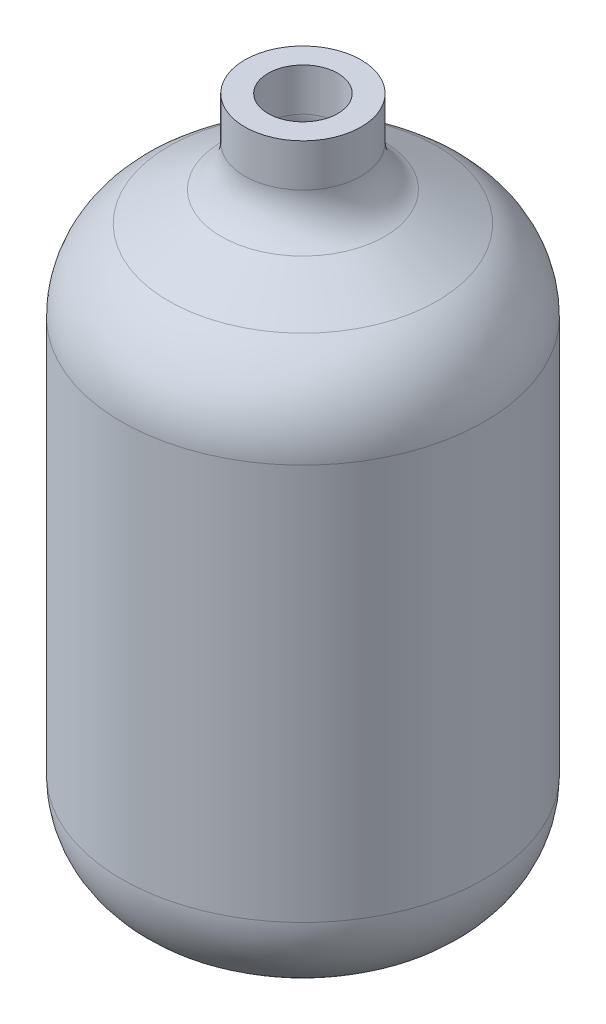
ISO-10303-21;
HEADER;
FILE_DESCRIPTION(('STEP AP214'),'2;1');
FILE_NAME('part.step','',(''),(''),'','','');
FILE_SCHEMA(('AUTOMOTIVE_DESIGN { 1 0 10303 214 1 1 1 1 }'));
ENDSEC;
DATA;
#1=APPLICATION_CONTEXT('core data for automotive mechanical design processes');
#2=APPLICATION_PROTOCOL_DEFINITION('international standard','automotive_design',2000,#1);
#3=PRODUCT_CONTEXT('',#1,'mechanical');
#4=PRODUCT('Part','Part','',(#3));
#5=PRODUCT_RELATED_PRODUCT_CATEGORY('part','',(#4));
#6=PRODUCT_DEFINITION_FORMATION('','',#4);
#7=PRODUCT_DEFINITION_CONTEXT('part definition',#1,'design');
#8=PRODUCT_DEFINITION('design','',#6,#7);
#9=PRODUCT_DEFINITION_SHAPE('','',#8);
#10=(LENGTH_UNIT() NAMED_UNIT(*) SI_UNIT(.MILLI.,.METRE.));
#11=(NAMED_UNIT(*) PLANE_ANGLE_UNIT() SI_UNIT($,.RADIAN.));
#12=(NAMED_UNIT(*) SI_UNIT($,.STERADIAN.) SOLID_ANGLE_UNIT());
#13=UNCERTAINTY_MEASURE_WITH_UNIT(LENGTH_MEASURE(1.E-05),#10,'distance_accuracy_value','');
#14=(GEOMETRIC_REPRESENTATION_CONTEXT(3) GLOBAL_UNCERTAINTY_ASSIGNED_CONTEXT((#13)) GLOBAL_UNIT_ASSIGNED_CONTEXT((#10,
#11,#12)) REPRESENTATION_CONTEXT('',''));
#15=CARTESIAN_POINT('',(0.,0.,0.));
#16=DIRECTION('',(0.,0.,1.));
#17=DIRECTION('',(1.,0.,0.));
#18=AXIS2_PLACEMENT_3D('',#15,#16,#17);
#19=CARTESIAN_POINT('',(0.,0.,0.));
#20=DIRECTION('',(0.,-1.,0.));
#21=DIRECTION('',(-1.,0.,0.));
#22=AXIS2_PLACEMENT_3D('',#19,#20,#21);
#23=SPHERICAL_SURFACE('',#22,25.4);
#24=CARTESIAN_POINT('',(0.,-23.3340278881508,0.));
#25=DIRECTION('',(0.,-1.,0.));
#26=DIRECTION('',(0.,0.,-1.));
#27=AXIS2_PLACEMENT_3D('',#24,#25,#26);
#28=CIRCLE('',#27,10.0340989886986);
#29=CARTESIAN_POINT('',(0.,-23.3340278881508,10.0340989886986));
#30=VERTEX_POINT('',#29);
#31=EDGE_CURVE('E10',#30,#30,#28,.T.);
#32=ORIENTED_EDGE('',*,*,#31,.T.);
#33=EDGE_LOOP('',(#32));
#34=FACE_BOUND('',#33,.T.);
#35=ADVANCED_FACE('F32',(#34),#23,.T.);
#36=CARTESIAN_POINT('',(0.,-12.9576449611273,0.));
#37=DIRECTION('',(0.,1.,0.));
#38=DIRECTION('',(0.,0.,1.));
#39=AXIS2_PLACEMENT_3D('',#36,#37,#38);
#40=CONICAL_SURFACE('',#39,34.1640989886986,1.1646813781007);
#41=CARTESIAN_POINT('',(0.,-12.9576449611273,0.));
#42=DIRECTION('',(0.,-1.,0.));
#43=DIRECTION('',(0.,0.,-1.));
#44=AXIS2_PLACEMENT_3D('',#41,#42,#43);
#45=CIRCLE('',#44,34.1640989886986);
#46=CARTESIAN_POINT('',(0.,-12.9576449611273,34.1640989886986));
#47=VERTEX_POINT('',#46);
#48=EDGE_CURVE('E38',#47,#47,#45,.T.);
#49=CARTESIAN_POINT('',(0.,-23.3340278881508,10.0340989886986));
#50=CARTESIAN_POINT('',(0.,-23.2259405659943,10.2854531553653));
#51=CARTESIAN_POINT('',(0.,-23.1178532438378,10.536807322032));
#52=CARTESIAN_POINT('',(0.,-22.9016785995248,11.0395156553653));
#53=CARTESIAN_POINT('',(0.,-22.7935912773683,11.290869822032));
#54=CARTESIAN_POINT('',(0.,-22.5774166330553,11.7935781553653));
#55=CARTESIAN_POINT('',(0.,-22.4693293108988,12.044932322032));
#56=CARTESIAN_POINT('',(0.,-22.2531546665858,12.5476406553653));
#57=CARTESIAN_POINT('',(0.,-22.1450673444293,12.798994822032));
#58=CARTESIAN_POINT('',(0.,-21.9288927001163,13.3017031553653));
#59=CARTESIAN_POINT('',(0.,-21.8208053779598,13.553057322032));
#60=CARTESIAN_POINT('',(0.,-21.6046307336468,14.0557656553653));
#61=CARTESIAN_POINT('',(0.,-21.4965434114904,14.307119822032));
#62=CARTESIAN_POINT('',(0.,-21.2803687671774,14.8098281553653));
#63=CARTESIAN_POINT('',(0.,-21.1722814450209,15.061182322032));
#64=CARTESIAN_POINT('',(0.,-20.9561068007079,15.5638906553653));
#65=CARTESIAN_POINT('',(0.,-20.8480194785514,15.815244822032));
#66=CARTESIAN_POINT('',(0.,-20.6318448342384,16.3179531553653));
#67=CARTESIAN_POINT('',(0.,-20.5237575120819,16.569307322032));
#68=CARTESIAN_POINT('',(0.,-20.3075828677689,17.0720156553653));
#69=CARTESIAN_POINT('',(0.,-20.1994955456124,17.323369822032));
#70=CARTESIAN_POINT('',(0.,-19.9833209012994,17.8260781553653));
#71=CARTESIAN_POINT('',(0.,-19.8752335791429,18.077432322032));
#72=CARTESIAN_POINT('',(0.,-19.6590589348299,18.5801406553653));
#73=CARTESIAN_POINT('',(0.,-19.5509716126734,18.831494822032));
#74=CARTESIAN_POINT('',(0.,-19.3347969683605,19.3342031553653));
#75=CARTESIAN_POINT('',(0.,-19.226709646204,19.585557322032));
#76=CARTESIAN_POINT('',(0.,-19.010535001891,20.0882656553653));
#77=CARTESIAN_POINT('',(0.,-18.9024476797345,20.339619822032));
#78=CARTESIAN_POINT('',(0.,-18.6862730354215,20.8423281553653));
#79=CARTESIAN_POINT('',(0.,-18.578185713265,21.093682322032));
#80=CARTESIAN_POINT('',(0.,-18.362011068952,21.5963906553653));
#81=CARTESIAN_POINT('',(0.,-18.2539237467955,21.847744822032));
#82=CARTESIAN_POINT('',(0.,-18.0377491024825,22.3504531553653));
#83=CARTESIAN_POINT('',(0.,-17.929661780326,22.601807322032));
#84=CARTESIAN_POINT('',(0.,-17.713487136013,23.1045156553653));
#85=CARTESIAN_POINT('',(0.,-17.6053998138565,23.355869822032));
#86=CARTESIAN_POINT('',(0.,-17.3892251695435,23.8585781553653));
#87=CARTESIAN_POINT('',(0.,-17.2811378473871,24.109932322032));
#88=CARTESIAN_POINT('',(0.,-17.0649632030741,24.6126406553653));
#89=CARTESIAN_POINT('',(0.,-16.9568758809176,24.863994822032));
#90=CARTESIAN_POINT('',(0.,-16.7407012366046,25.3667031553653));
#91=CARTESIAN_POINT('',(0.,-16.6326139144481,25.618057322032));
#92=CARTESIAN_POINT('',(0.,-16.4164392701351,26.1207656553653));
#93=CARTESIAN_POINT('',(0.,-16.3083519479786,26.372119822032));
#94=CARTESIAN_POINT('',(0.,-16.0921773036656,26.8748281553653));
#95=CARTESIAN_POINT('',(0.,-15.9840899815091,27.126182322032));
#96=CARTESIAN_POINT('',(0.,-15.7679153371961,27.6288906553653));
#97=CARTESIAN_POINT('',(0.,-15.6598280150396,27.880244822032));
#98=CARTESIAN_POINT('',(0.,-15.4436533707266,28.3829531553653));
#99=CARTESIAN_POINT('',(0.,-15.3355660485701,28.634307322032));
#100=CARTESIAN_POINT('',(0.,-15.1193914042572,29.1370156553653));
#101=CARTESIAN_POINT('',(0.,-15.0113040821007,29.388369822032));
#102=CARTESIAN_POINT('',(0.,-14.7951294377877,29.8910781553653));
#103=CARTESIAN_POINT('',(0.,-14.6870421156312,30.142432322032));
#104=CARTESIAN_POINT('',(0.,-14.4708674713182,30.6451406553653));
#105=CARTESIAN_POINT('',(0.,-14.3627801491617,30.896494822032));
#106=CARTESIAN_POINT('',(0.,-14.1466055048487,31.3992031553653));
#107=CARTESIAN_POINT('',(0.,-14.0385181826922,31.650557322032));
#108=CARTESIAN_POINT('',(0.,-13.8223435383792,32.1532656553653));
#109=CARTESIAN_POINT('',(0.,-13.7142562162227,32.404619822032));
#110=CARTESIAN_POINT('',(0.,-13.4980815719097,32.9073281553653));
#111=CARTESIAN_POINT('',(0.,-13.3899942497532,33.158682322032));
#112=CARTESIAN_POINT('',(0.,-13.1738196054402,33.6613906553653));
#113=CARTESIAN_POINT('',(0.,-13.0657322832838,33.912744822032));
#114=CARTESIAN_POINT('',(0.,-12.9576449611273,34.1640989886986));
#115=B_SPLINE_CURVE_WITH_KNOTS('',3,(#49,#50,#51,#52,#53,#54,#55,#56,#57,#58,#59,#60,#61,#62,
#63,#64,#65,#66,#67,#68,#69,#70,#71,#72,#73,#74,#75,#76,#77,#78,#79,#80,#81,#82,#83,#84,#85,#86,
#87,#88,#89,#90,#91,#92,#93,#94,#95,#96,#97,#98,#99,#100,#101,#102,#103,#104,#105,#106,#107,
#108,#109,#110,#111,#112,#113,#114),.UNSPECIFIED.,.F.,.F.,(4,2,2,2,2,2,2,2,2,2,2,2,2,2,2,2,2,2,
2,2,2,2,2,2,2,2,2,2,2,2,2,2,4),(0.,0.820826459615494,1.64165291923099,2.46247937884648,
3.28330583846197,4.10413229807747,4.92495875769296,5.74578521730846,6.56661167692395,
7.38743813653944,8.20826459615494,9.02909105577043,9.84991751538592,10.6707439750014,
11.4915704346169,12.3123968942324,13.1332233538479,13.9540498134634,14.7748762730789,
15.5957027326944,16.4165291923099,17.2373556519254,18.0581821115409,18.8790085711564,
19.6998350307719,20.5206614903874,21.3414879500029,22.1623144096183,22.9831408692338,
23.8039673288493,24.6247937884648,25.4456202480803,26.2664467076958),.UNSPECIFIED.);
#116=EDGE_CURVE('BSEAM105',#30,#47,#115,.T.);
#117=ORIENTED_EDGE('',*,*,#31,.F.);
#118=ORIENTED_EDGE('',*,*,#48,.T.);
#119=ORIENTED_EDGE('',*,*,#116,.T.);
#120=ORIENTED_EDGE('',*,*,#116,.F.);
#121=EDGE_LOOP('',(#117,#119,#118,#120));
#122=FACE_BOUND('',#121,.T.);
#123=ADVANCED_FACE('F105',(#122),#40,.T.);
#124=CARTESIAN_POINT('',(0.,10.3763829270235,0.));
#125=DIRECTION('',(0.,-1.,0.));
#126=DIRECTION('',(0.,0.,-1.));
#127=AXIS2_PLACEMENT_3D('',#124,#125,#126);
#128=DEGENERATE_TOROIDAL_SURFACE('',#127,24.13,25.4,.T.);
#129=ORIENTED_EDGE('',*,*,#48,.F.);
#130=EDGE_LOOP('',(#129));
#131=FACE_BOUND('',#130,.T.);
#132=CARTESIAN_POINT('',(0.,10.3763829270235,0.));
#133=DIRECTION('',(0.,-1.,0.));
#134=DIRECTION('',(0.,0.,-1.));
#135=AXIS2_PLACEMENT_3D('',#132,#133,#134);
#136=CIRCLE('',#135,49.53);
#137=CARTESIAN_POINT('',(0.,10.3763829270235,-49.53));
#138=VERTEX_POINT('',#137);
#139=EDGE_CURVE('E42',#138,#138,#136,.T.);
#140=ORIENTED_EDGE('',*,*,#139,.T.);
#141=EDGE_LOOP('',(#140));
#142=FACE_BOUND('',#141,.T.);
#143=ADVANCED_FACE('F109',(#131,#142),#128,.T.);
#144=CARTESIAN_POINT('',(0.,0.,0.));
#145=DIRECTION('',(0.,-1.,0.));
#146=DIRECTION('',(0.,0.,-1.));
#147=AXIS2_PLACEMENT_3D('',#144,#145,#146);
#148=CYLINDRICAL_SURFACE('',#147,49.53);
#149=ORIENTED_EDGE('',*,*,#139,.F.);
#150=EDGE_LOOP('',(#149));
#151=FACE_BOUND('',#150,.T.);
#152=CARTESIAN_POINT('',(0.,118.540573173127,0.));
#153=DIRECTION('',(0.,-1.,0.));
#154=DIRECTION('',(0.,0.,-1.));
#155=AXIS2_PLACEMENT_3D('',#152,#153,#154);
#156=CIRCLE('',#155,49.53);
#157=CARTESIAN_POINT('',(0.,118.540573173127,-49.53));
#158=VERTEX_POINT('',#157);
#159=EDGE_CURVE('E46',#158,#158,#156,.T.);
#160=ORIENTED_EDGE('',*,*,#159,.T.);
#161=EDGE_LOOP('',(#160));
#162=FACE_BOUND('',#161,.T.);
#163=ADVANCED_FACE('F114',(#151,#162),#148,.T.);
#164=CARTESIAN_POINT('',(0.,118.540573173127,0.));
#165=DIRECTION('',(0.,-1.,0.));
#166=DIRECTION('',(0.,0.,-1.));
#167=AXIS2_PLACEMENT_3D('',#164,#165,#166);
#168=DEGENERATE_TOROIDAL_SURFACE('',#167,24.13,25.4,.T.);
#169=ORIENTED_EDGE('',*,*,#159,.F.);
#170=EDGE_LOOP('',(#169));
#171=FACE_BOUND('',#170,.T.);
#172=CARTESIAN_POINT('',(0.,140.645097291942,0.));
#173=DIRECTION('',(0.,-1.,0.));
#174=DIRECTION('',(0.,0.,-1.));
#175=AXIS2_PLACEMENT_3D('',#172,#173,#174);
#176=CIRCLE('',#175,36.641994784235);
#177=CARTESIAN_POINT('',(0.,140.645097291942,-36.641994784235));
#178=VERTEX_POINT('',#177);
#179=EDGE_CURVE('E51',#178,#178,#176,.T.);
#180=ORIENTED_EDGE('',*,*,#179,.T.);
#181=EDGE_LOOP('',(#180));
#182=FACE_BOUND('',#181,.T.);
#183=ADVANCED_FACE('F120',(#171,#182),#168,.T.);
#184=CARTESIAN_POINT('',(0.,148.752451354029,0.));
#185=DIRECTION('',(0.,-1.,0.));
#186=DIRECTION('',(0.,0.,-1.));
#187=AXIS2_PLACEMENT_3D('',#184,#185,#186);
#188=CONICAL_SURFACE('',#187,22.3190026078825,1.05572350977611);
#189=ORIENTED_EDGE('',*,*,#179,.F.);
#190=EDGE_LOOP('',(#189));
#191=FACE_BOUND('',#190,.T.);
#192=CARTESIAN_POINT('',(0.,148.752451354029,0.));
#193=DIRECTION('',(0.,-1.,0.));
#194=DIRECTION('',(0.,0.,-1.));
#195=AXIS2_PLACEMENT_3D('',#192,#193,#194);
#196=CIRCLE('',#195,22.3190026078825);
#197=CARTESIAN_POINT('',(0.,148.752451354029,-22.3190026078825));
#198=VERTEX_POINT('',#197);
#199=EDGE_CURVE('E54',#198,#198,#196,.T.);
#200=ORIENTED_EDGE('',*,*,#199,.T.);
#201=EDGE_LOOP('',(#200));
#202=FACE_BOUND('',#201,.T.);
#203=ADVANCED_FACE('F124',(#191,#202),#188,.T.);
#204=CARTESIAN_POINT('',(0.,159.804713413436,0.));
#205=DIRECTION('',(0.,-1.,0.));
#206=DIRECTION('',(0.,0.,-1.));
#207=AXIS2_PLACEMENT_3D('',#204,#205,#206);
#208=TOROIDAL_SURFACE('',#207,28.575,12.7);
#209=ORIENTED_EDGE('',*,*,#199,.F.);
#210=EDGE_LOOP('',(#209));
#211=FACE_BOUND('',#210,.T.);
#212=CARTESIAN_POINT('',(0.,159.804713413436,0.));
#213=DIRECTION('',(0.,-1.,0.));
#214=DIRECTION('',(0.,0.,-1.));
#215=AXIS2_PLACEMENT_3D('',#212,#213,#214);
#216=CIRCLE('',#215,15.875);
#217=CARTESIAN_POINT('',(0.,159.804713413436,-15.875));
#218=VERTEX_POINT('',#217);
#219=EDGE_CURVE('E57',#218,#218,#216,.T.);
#220=ORIENTED_EDGE('',*,*,#219,.T.);
#221=EDGE_LOOP('',(#220));
#222=FACE_BOUND('',#221,.T.);
#223=ADVANCED_FACE('F128',(#211,#222),#208,.F.);
#224=CARTESIAN_POINT('',(0.,0.,0.));
#225=DIRECTION('',(0.,-1.,0.));
#226=DIRECTION('',(0.,0.,-1.));
#227=AXIS2_PLACEMENT_3D('',#224,#225,#226);
#228=CYLINDRICAL_SURFACE('',#227,15.875);
#229=ORIENTED_EDGE('',*,*,#219,.F.);
#230=EDGE_LOOP('',(#229));
#231=FACE_BOUND('',#230,.T.);
#232=CARTESIAN_POINT('',(0.,171.45,0.));
#233=DIRECTION('',(0.,-1.,0.));
#234=DIRECTION('',(0.,0.,-1.));
#235=AXIS2_PLACEMENT_3D('',#232,#233,#234);
#236=CIRCLE('',#235,15.875);
#237=CARTESIAN_POINT('',(0.,171.45,-15.875));
#238=VERTEX_POINT('',#237);
#239=EDGE_CURVE('E60',#238,#238,#236,.T.);
#240=ORIENTED_EDGE('',*,*,#239,.T.);
#241=EDGE_LOOP('',(#240));
#242=FACE_BOUND('',#241,.T.);
#243=ADVANCED_FACE('F101',(#231,#242),#228,.T.);
#244=CARTESIAN_POINT('',(-15.875,171.45,0.));
#245=DIRECTION('',(0.,-1.,0.));
#246=DIRECTION('',(0.,0.,-1.));
#247=AXIS2_PLACEMENT_3D('',#244,#245,#246);
#248=PLANE('',#247);
#249=CARTESIAN_POINT('',(0.,171.45,0.));
#250=DIRECTION('',(0.,-1.,0.));
#251=DIRECTION('',(0.,0.,-1.));
#252=AXIS2_PLACEMENT_3D('',#249,#250,#251);
#253=CIRCLE('',#252,9.525);
#254=CARTESIAN_POINT('',(0.,171.45,-9.525));
#255=VERTEX_POINT('',#254);
#256=EDGE_CURVE('E64',#255,#255,#253,.T.);
#257=ORIENTED_EDGE('',*,*,#256,.T.);
#258=EDGE_LOOP('',(#257));
#259=FACE_BOUND('',#258,.T.);
#260=ORIENTED_EDGE('',*,*,#239,.F.);
#261=EDGE_LOOP('',(#260));
#262=FACE_BOUND('',#261,.T.);
#263=ADVANCED_FACE('F93',(#259,#262),#248,.F.);
#264=CARTESIAN_POINT('',(0.,0.,0.));
#265=DIRECTION('',(0.,-1.,0.));
#266=DIRECTION('',(-1.,0.,0.));
#267=AXIS2_PLACEMENT_3D('',#264,#265,#266);
#268=SPHERICAL_SURFACE('',#267,19.05);
#269=CARTESIAN_POINT('',(0.,-17.5005209161131,0.));
#270=DIRECTION('',(0.,-1.,0.));
#271=DIRECTION('',(0.,0.,-1.));
#272=AXIS2_PLACEMENT_3D('',#269,#270,#271);
#273=CIRCLE('',#272,7.52557424152397);
#274=CARTESIAN_POINT('',(0.,-17.5005209161131,7.52557424152399));
#275=VERTEX_POINT('',#274);
#276=EDGE_CURVE('E63',#275,#275,#273,.T.);
#277=ORIENTED_EDGE('',*,*,#276,.F.);
#278=EDGE_LOOP('',(#277));
#279=FACE_BOUND('',#278,.T.);
#280=ADVANCED_FACE('F91',(#279),#268,.F.);
#281=CARTESIAN_POINT('',(0.,-7.12413798908957,0.));
#282=DIRECTION('',(0.,1.,0.));
#283=DIRECTION('',(0.,0.,1.));
#284=AXIS2_PLACEMENT_3D('',#281,#282,#283);
#285=CONICAL_SURFACE('',#284,31.655574241524,1.1646813781007);
#286=CARTESIAN_POINT('',(0.,-7.12413798908957,0.));
#287=DIRECTION('',(0.,1.,0.));
#288=DIRECTION('',(0.,0.,1.));
#289=AXIS2_PLACEMENT_3D('',#286,#287,#288);
#290=CIRCLE('',#289,31.655574241524);
#291=CARTESIAN_POINT('',(0.,-7.12413798908957,31.655574241524));
#292=VERTEX_POINT('',#291);
#293=EDGE_CURVE('E82',#292,#292,#290,.F.);
#294=CARTESIAN_POINT('',(0.,-17.5005209161131,7.52557424152399));
#295=CARTESIAN_POINT('',(0.,-17.3924335939566,7.77692840819065));
#296=CARTESIAN_POINT('',(0.,-17.2843462718001,8.02828257485732));
#297=CARTESIAN_POINT('',(0.,-17.0681716274871,8.53099090819065));
#298=CARTESIAN_POINT('',(0.,-16.9600843053306,8.78234507485732));
#299=CARTESIAN_POINT('',(0.,-16.7439096610176,9.28505340819065));
#300=CARTESIAN_POINT('',(0.,-16.6358223388611,9.53640757485732));
#301=CARTESIAN_POINT('',(0.,-16.4196476945481,10.0391159081907));
#302=CARTESIAN_POINT('',(0.,-16.3115603723916,10.2904700748573));
#303=CARTESIAN_POINT('',(0.,-16.0953857280786,10.7931784081907));
#304=CARTESIAN_POINT('',(0.,-15.9872984059221,11.0445325748573));
#305=CARTESIAN_POINT('',(0.,-15.7711237616092,11.5472409081907));
#306=CARTESIAN_POINT('',(0.,-15.6630364394527,11.7985950748573));
#307=CARTESIAN_POINT('',(0.,-15.4468617951397,12.3013034081907));
#308=CARTESIAN_POINT('',(0.,-15.3387744729832,12.5526575748573));
#309=CARTESIAN_POINT('',(0.,-15.1225998286702,13.0553659081906));
#310=CARTESIAN_POINT('',(0.,-15.0145125065137,13.3067200748573));
#311=CARTESIAN_POINT('',(0.,-14.7983378622007,13.8094284081906));
#312=CARTESIAN_POINT('',(0.,-14.6902505400442,14.0607825748573));
#313=CARTESIAN_POINT('',(0.,-14.4740758957312,14.5634909081906));
#314=CARTESIAN_POINT('',(0.,-14.3659885735747,14.8148450748573));
#315=CARTESIAN_POINT('',(0.,-14.1498139292617,15.3175534081906));
#316=CARTESIAN_POINT('',(0.,-14.0417266071052,15.5689075748573));
#317=CARTESIAN_POINT('',(0.,-13.8255519627922,16.0716159081906));
#318=CARTESIAN_POINT('',(0.,-13.7174646406358,16.3229700748573));
#319=CARTESIAN_POINT('',(0.,-13.5012899963228,16.8256784081906));
#320=CARTESIAN_POINT('',(0.,-13.3932026741663,17.0770325748573));
#321=CARTESIAN_POINT('',(0.,-13.1770280298533,17.5797409081906));
#322=CARTESIAN_POINT('',(0.,-13.0689407076968,17.8310950748573));
#323=CARTESIAN_POINT('',(0.,-12.8527660633838,18.3338034081906));
#324=CARTESIAN_POINT('',(0.,-12.7446787412273,18.5851575748573));
#325=CARTESIAN_POINT('',(0.,-12.5285040969143,19.0878659081906));
#326=CARTESIAN_POINT('',(0.,-12.4204167747578,19.3392200748573));
#327=CARTESIAN_POINT('',(0.,-12.2042421304448,19.8419284081906));
#328=CARTESIAN_POINT('',(0.,-12.0961548082883,20.0932825748573));
#329=CARTESIAN_POINT('',(0.,-11.8799801639753,20.5959909081906));
#330=CARTESIAN_POINT('',(0.,-11.7718928418188,20.8473450748573));
#331=CARTESIAN_POINT('',(0.,-11.5557181975059,21.3500534081906));
#332=CARTESIAN_POINT('',(0.,-11.4476308753494,21.6014075748573));
#333=CARTESIAN_POINT('',(0.,-11.2314562310364,22.1041159081906));
#334=CARTESIAN_POINT('',(0.,-11.1233689088799,22.3554700748573));
#335=CARTESIAN_POINT('',(0.,-10.9071942645669,22.8581784081906));
#336=CARTESIAN_POINT('',(0.,-10.7991069424104,23.1095325748573));
#337=CARTESIAN_POINT('',(0.,-10.5829322980974,23.6122409081906));
#338=CARTESIAN_POINT('',(0.,-10.4748449759409,23.8635950748573));
#339=CARTESIAN_POINT('',(0.,-10.2586703316279,24.3663034081906));
#340=CARTESIAN_POINT('',(0.,-10.1505830094714,24.6176575748573));
#341=CARTESIAN_POINT('',(0.,-9.93440836515843,25.1203659081906));
#342=CARTESIAN_POINT('',(0.,-9.82632104300194,25.3717200748573));
#343=CARTESIAN_POINT('',(0.,-9.61014639868895,25.8744284081906));
#344=CARTESIAN_POINT('',(0.,-9.50205907653246,26.1257825748573));
#345=CARTESIAN_POINT('',(0.,-9.28588443221947,26.6284909081906));
#346=CARTESIAN_POINT('',(0.,-9.17779711006297,26.8798450748573));
#347=CARTESIAN_POINT('',(0.,-8.96162246574998,27.3825534081906));
#348=CARTESIAN_POINT('',(0.,-8.85353514359349,27.6339075748573));
#349=CARTESIAN_POINT('',(0.,-8.6373604992805,28.1366159081906));
#350=CARTESIAN_POINT('',(0.,-8.529273177124,28.3879700748573));
#351=CARTESIAN_POINT('',(0.,-8.31309853281101,28.8906784081906));
#352=CARTESIAN_POINT('',(0.,-8.20501121065452,29.1420325748573));
#353=CARTESIAN_POINT('',(0.,-7.98883656634153,29.6447409081906));
#354=CARTESIAN_POINT('',(0.,-7.88074924418503,29.8960950748573));
#355=CARTESIAN_POINT('',(0.,-7.66457459987204,30.3988034081906));
#356=CARTESIAN_POINT('',(0.,-7.55648727771555,30.6501575748573));
#357=CARTESIAN_POINT('',(0.,-7.34031263340256,31.1528659081906));
#358=CARTESIAN_POINT('',(0.,-7.23222531124607,31.4042200748573));
#359=CARTESIAN_POINT('',(0.,-7.12413798908957,31.655574241524));
#360=B_SPLINE_CURVE_WITH_KNOTS('',3,(#294,#295,#296,#297,#298,#299,#300,#301,#302,#303,#304,
#305,#306,#307,#308,#309,#310,#311,#312,#313,#314,#315,#316,#317,#318,#319,#320,#321,#322,#323,
#324,#325,#326,#327,#328,#329,#330,#331,#332,#333,#334,#335,#336,#337,#338,#339,#340,#341,#342,
#343,#344,#345,#346,#347,#348,#349,#350,#351,#352,#353,#354,#355,#356,#357,#358,#359),
.UNSPECIFIED.,.F.,.F.,(4,2,2,2,2,2,2,2,2,2,2,2,2,2,2,2,2,2,2,2,2,2,2,2,2,2,2,2,2,2,2,2,4),(0.,
0.820826459615491,1.64165291923099,2.46247937884648,3.28330583846198,4.10413229807747,
4.92495875769296,5.74578521730845,6.56661167692395,7.38743813653944,8.20826459615493,
9.02909105577043,9.84991751538592,10.6707439750014,11.4915704346169,12.3123968942324,
13.1332233538479,13.9540498134634,14.7748762730789,15.5957027326944,16.4165291923099,
17.2373556519254,18.0581821115409,18.8790085711564,19.6998350307718,20.5206614903873,
21.3414879500028,22.1623144096183,22.9831408692338,23.8039673288493,24.6247937884648,
25.4456202480803,26.2664467076958),.UNSPECIFIED.);
#361=EDGE_CURVE('BSEAM88',#275,#292,#360,.T.);
#362=ORIENTED_EDGE('',*,*,#276,.T.);
#363=ORIENTED_EDGE('',*,*,#293,.F.);
#364=ORIENTED_EDGE('',*,*,#361,.T.);
#365=ORIENTED_EDGE('',*,*,#361,.F.);
#366=EDGE_LOOP('',(#362,#364,#363,#365));
#367=FACE_BOUND('',#366,.T.);
#368=ADVANCED_FACE('F88',(#367),#285,.F.);
#369=CARTESIAN_POINT('',(0.,10.3763829270235,0.));
#370=DIRECTION('',(0.,-1.,0.));
#371=DIRECTION('',(0.,0.,-1.));
#372=AXIS2_PLACEMENT_3D('',#369,#370,#371);
#373=TOROIDAL_SURFACE('',#372,24.13,19.05);
#374=ORIENTED_EDGE('',*,*,#293,.T.);
#375=EDGE_LOOP('',(#374));
#376=FACE_BOUND('',#375,.T.);
#377=CARTESIAN_POINT('',(0.,10.3763829270235,0.));
#378=DIRECTION('',(0.,-1.,0.));
#379=DIRECTION('',(0.,0.,-1.));
#380=AXIS2_PLACEMENT_3D('',#377,#378,#379);
#381=CIRCLE('',#380,43.18);
#382=CARTESIAN_POINT('',(0.,10.3763829270235,-43.18));
#383=VERTEX_POINT('',#382);
#384=EDGE_CURVE('E79',#383,#383,#381,.T.);
#385=ORIENTED_EDGE('',*,*,#384,.F.);
#386=EDGE_LOOP('',(#385));
#387=FACE_BOUND('',#386,.T.);
#388=ADVANCED_FACE('F99',(#376,#387),#373,.F.);
#389=CARTESIAN_POINT('',(0.,0.,0.));
#390=DIRECTION('',(0.,-1.,0.));
#391=DIRECTION('',(0.,0.,-1.));
#392=AXIS2_PLACEMENT_3D('',#389,#390,#391);
#393=CYLINDRICAL_SURFACE('',#392,43.18);
#394=ORIENTED_EDGE('',*,*,#384,.T.);
#395=EDGE_LOOP('',(#394));
#396=FACE_BOUND('',#395,.T.);
#397=CARTESIAN_POINT('',(0.,118.540573173127,0.));
#398=DIRECTION('',(0.,-1.,0.));
#399=DIRECTION('',(0.,0.,-1.));
#400=AXIS2_PLACEMENT_3D('',#397,#398,#399);
#401=CIRCLE('',#400,43.18);
#402=CARTESIAN_POINT('',(0.,118.540573173127,-43.18));
#403=VERTEX_POINT('',#402);
#404=EDGE_CURVE('E76',#403,#403,#401,.T.);
#405=ORIENTED_EDGE('',*,*,#404,.F.);
#406=EDGE_LOOP('',(#405));
#407=FACE_BOUND('',#406,.T.);
#408=ADVANCED_FACE('F151',(#396,#407),#393,.F.);
#409=CARTESIAN_POINT('',(0.,118.540573173127,0.));
#410=DIRECTION('',(0.,-1.,0.));
#411=DIRECTION('',(0.,0.,-1.));
#412=AXIS2_PLACEMENT_3D('',#409,#410,#411);
#413=TOROIDAL_SURFACE('',#412,24.13,19.05);
#414=ORIENTED_EDGE('',*,*,#404,.T.);
#415=EDGE_LOOP('',(#414));
#416=FACE_BOUND('',#415,.T.);
#417=CARTESIAN_POINT('',(0.,135.118966262239,0.));
#418=DIRECTION('',(0.,-1.,0.));
#419=DIRECTION('',(0.,0.,-1.));
#420=AXIS2_PLACEMENT_3D('',#417,#418,#419);
#421=CIRCLE('',#420,33.5139960881762);
#422=CARTESIAN_POINT('',(0.,135.118966262239,-33.5139960881762));
#423=VERTEX_POINT('',#422);
#424=EDGE_CURVE('E73',#423,#423,#421,.T.);
#425=ORIENTED_EDGE('',*,*,#424,.F.);
#426=EDGE_LOOP('',(#425));
#427=FACE_BOUND('',#426,.T.);
#428=ADVANCED_FACE('F147',(#416,#427),#413,.F.);
#429=CARTESIAN_POINT('',(0.,143.226320324325,0.));
#430=DIRECTION('',(0.,-1.,0.));
#431=DIRECTION('',(0.,0.,-1.));
#432=AXIS2_PLACEMENT_3D('',#429,#430,#431);
#433=CONICAL_SURFACE('',#432,19.1910039118238,1.05572350977611);
#434=ORIENTED_EDGE('',*,*,#424,.T.);
#435=EDGE_LOOP('',(#434));
#436=FACE_BOUND('',#435,.T.);
#437=CARTESIAN_POINT('',(0.,143.226320324325,0.));
#438=DIRECTION('',(0.,-1.,0.));
#439=DIRECTION('',(0.,0.,-1.));
#440=AXIS2_PLACEMENT_3D('',#437,#438,#439);
#441=CIRCLE('',#440,19.1910039118238);
#442=CARTESIAN_POINT('',(0.,143.226320324325,-19.1910039118238));
#443=VERTEX_POINT('',#442);
#444=EDGE_CURVE('E70',#443,#443,#441,.T.);
#445=ORIENTED_EDGE('',*,*,#444,.F.);
#446=EDGE_LOOP('',(#445));
#447=FACE_BOUND('',#446,.T.);
#448=ADVANCED_FACE('F143',(#436,#447),#433,.F.);
#449=CARTESIAN_POINT('',(0.,159.804713413436,0.));
#450=DIRECTION('',(0.,-1.,0.));
#451=DIRECTION('',(0.,0.,-1.));
#452=AXIS2_PLACEMENT_3D('',#449,#450,#451);
#453=TOROIDAL_SURFACE('',#452,28.575,19.05);
#454=ORIENTED_EDGE('',*,*,#444,.T.);
#455=EDGE_LOOP('',(#454));
#456=FACE_BOUND('',#455,.T.);
#457=CARTESIAN_POINT('',(0.,159.804713413436,0.));
#458=DIRECTION('',(0.,-1.,0.));
#459=DIRECTION('',(0.,0.,-1.));
#460=AXIS2_PLACEMENT_3D('',#457,#458,#459);
#461=CIRCLE('',#460,9.525);
#462=CARTESIAN_POINT('',(0.,159.804713413436,-9.525));
#463=VERTEX_POINT('',#462);
#464=EDGE_CURVE('E67',#463,#463,#461,.T.);
#465=ORIENTED_EDGE('',*,*,#464,.F.);
#466=EDGE_LOOP('',(#465));
#467=FACE_BOUND('',#466,.T.);
#468=ADVANCED_FACE('F139',(#456,#467),#453,.T.);
#469=CARTESIAN_POINT('',(0.,0.,0.));
#470=DIRECTION('',(0.,-1.,0.));
#471=DIRECTION('',(0.,0.,-1.));
#472=AXIS2_PLACEMENT_3D('',#469,#470,#471);
#473=CYLINDRICAL_SURFACE('',#472,9.525);
#474=ORIENTED_EDGE('',*,*,#464,.T.);
#475=EDGE_LOOP('',(#474));
#476=FACE_BOUND('',#475,.T.);
#477=ORIENTED_EDGE('',*,*,#256,.F.);
#478=EDGE_LOOP('',(#477));
#479=FACE_BOUND('',#478,.T.);
#480=ADVANCED_FACE('F136',(#476,#479),#473,.F.);
#481=CLOSED_SHELL('',(#35,#123,#143,#163,#183,#203,#223,#243,#263,#280,#368,#388,#408,#428,#448,
#468,#480));
#482=MANIFOLD_SOLID_BREP('B2',#481);
#483=ADVANCED_BREP_SHAPE_REPRESENTATION('',(#18,#482),#14);
#484=SHAPE_DEFINITION_REPRESENTATION(#9,#483);
ENDSEC;
END-ISO-10303-21;
